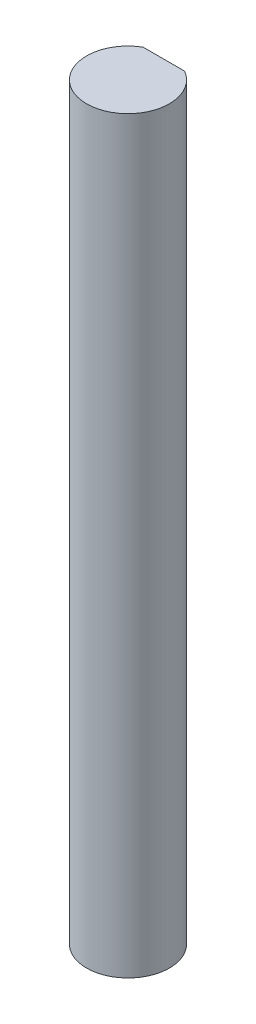
ISO-10303-21;
HEADER;
FILE_DESCRIPTION(('STEP AP214'),'2;1');
FILE_NAME('part.step','',(''),(''),'','','');
FILE_SCHEMA(('AUTOMOTIVE_DESIGN { 1 0 10303 214 1 1 1 1 }'));
ENDSEC;
DATA;
#1=APPLICATION_CONTEXT('core data for automotive mechanical design processes');
#2=APPLICATION_PROTOCOL_DEFINITION('international standard','automotive_design',2000,#1);
#3=PRODUCT_CONTEXT('',#1,'mechanical');
#4=PRODUCT('Part','Part','',(#3));
#5=PRODUCT_RELATED_PRODUCT_CATEGORY('part','',(#4));
#6=PRODUCT_DEFINITION_FORMATION('','',#4);
#7=PRODUCT_DEFINITION_CONTEXT('part definition',#1,'design');
#8=PRODUCT_DEFINITION('design','',#6,#7);
#9=PRODUCT_DEFINITION_SHAPE('','',#8);
#10=(LENGTH_UNIT() NAMED_UNIT(*) SI_UNIT(.MILLI.,.METRE.));
#11=(NAMED_UNIT(*) PLANE_ANGLE_UNIT() SI_UNIT($,.RADIAN.));
#12=(NAMED_UNIT(*) SI_UNIT($,.STERADIAN.) SOLID_ANGLE_UNIT());
#13=UNCERTAINTY_MEASURE_WITH_UNIT(LENGTH_MEASURE(1.E-05),#10,'distance_accuracy_value','');
#14=(GEOMETRIC_REPRESENTATION_CONTEXT(3) GLOBAL_UNCERTAINTY_ASSIGNED_CONTEXT((#13)) GLOBAL_UNIT_ASSIGNED_CONTEXT((#10,
#11,#12)) REPRESENTATION_CONTEXT('',''));
#15=CARTESIAN_POINT('',(0.,0.,0.));
#16=DIRECTION('',(0.,0.,1.));
#17=DIRECTION('',(1.,0.,0.));
#18=AXIS2_PLACEMENT_3D('',#15,#16,#17);
#19=CARTESIAN_POINT('',(0.,-43.000000106,-4.12077328786722));
#20=DIRECTION('',(0.,0.,1.));
#21=DIRECTION('',(1.,0.,0.));
#22=AXIS2_PLACEMENT_3D('',#19,#20,#21);
#23=PLANE('',#22);
#24=DIRECTION('',(0.,1.,0.));
#25=VECTOR('',#24,1.);
#26=CARTESIAN_POINT('',(-2.3876,-43.000000106,-4.12077328786722));
#27=LINE('',#26,#25);
#28=CARTESIAN_POINT('',(-2.3876,-43.000000106,-4.12077328786722));
#29=VERTEX_POINT('',#28);
#30=CARTESIAN_POINT('',(-2.3876,43.,-4.12077328786722));
#31=VERTEX_POINT('',#30);
#32=EDGE_CURVE('E44',#29,#31,#27,.T.);
#33=ORIENTED_EDGE('',*,*,#32,.T.);
#34=DIRECTION('',(1.,0.,0.));
#35=VECTOR('',#34,1.);
#36=CARTESIAN_POINT('',(0.,43.,-4.12077328786722));
#37=LINE('',#36,#35);
#38=CARTESIAN_POINT('',(2.3876,43.,-4.12077328786722));
#39=VERTEX_POINT('',#38);
#40=EDGE_CURVE('E69',#31,#39,#37,.T.);
#41=ORIENTED_EDGE('',*,*,#40,.T.);
#42=DIRECTION('',(0.,1.,0.));
#43=VECTOR('',#42,1.);
#44=CARTESIAN_POINT('',(2.3876,-43.000000106,-4.12077328786722));
#45=LINE('',#44,#43);
#46=CARTESIAN_POINT('',(2.3876,-43.000000106,-4.12077328786722));
#47=VERTEX_POINT('',#46);
#48=EDGE_CURVE('E11',#47,#39,#45,.T.);
#49=ORIENTED_EDGE('',*,*,#48,.F.);
#50=DIRECTION('',(1.,0.,0.));
#51=VECTOR('',#50,1.);
#52=CARTESIAN_POINT('',(0.,-43.000000106,-4.12077328786722));
#53=LINE('',#52,#51);
#54=EDGE_CURVE('E55',#29,#47,#53,.T.);
#55=ORIENTED_EDGE('',*,*,#54,.F.);
#56=EDGE_LOOP('',(#33,#41,#49,#55));
#57=FACE_BOUND('',#56,.T.);
#58=ADVANCED_FACE('F41',(#57),#23,.F.);
#59=CARTESIAN_POINT('',(0.,-43.000000106,0.));
#60=DIRECTION('',(0.,1.,0.));
#61=DIRECTION('',(0.,0.,1.));
#62=AXIS2_PLACEMENT_3D('',#59,#60,#61);
#63=CYLINDRICAL_SURFACE('',#62,4.7625);
#64=ORIENTED_EDGE('',*,*,#48,.T.);
#65=CARTESIAN_POINT('',(0.,43.,0.));
#66=DIRECTION('',(0.,1.,0.));
#67=DIRECTION('',(0.,0.,1.));
#68=AXIS2_PLACEMENT_3D('',#65,#66,#67);
#69=CIRCLE('',#68,4.7625);
#70=EDGE_CURVE('E73',#31,#39,#69,.T.);
#71=ORIENTED_EDGE('',*,*,#70,.F.);
#72=ORIENTED_EDGE('',*,*,#32,.F.);
#73=CARTESIAN_POINT('',(0.,-43.000000106,0.));
#74=DIRECTION('',(0.,1.,0.));
#75=DIRECTION('',(0.,0.,1.));
#76=AXIS2_PLACEMENT_3D('',#73,#74,#75);
#77=CIRCLE('',#76,4.7625);
#78=EDGE_CURVE('E71',#29,#47,#77,.T.);
#79=ORIENTED_EDGE('',*,*,#78,.T.);
#80=EDGE_LOOP('',(#64,#71,#72,#79));
#81=FACE_BOUND('',#80,.T.);
#82=ADVANCED_FACE('F74',(#81),#63,.T.);
#83=CARTESIAN_POINT('',(0.,-43.000000106,0.));
#84=DIRECTION('',(0.,1.,0.));
#85=DIRECTION('',(0.,0.,1.));
#86=AXIS2_PLACEMENT_3D('',#83,#84,#85);
#87=PLANE('',#86);
#88=ORIENTED_EDGE('',*,*,#54,.T.);
#89=ORIENTED_EDGE('',*,*,#78,.F.);
#90=EDGE_LOOP('',(#88,#89));
#91=FACE_BOUND('',#90,.T.);
#92=ADVANCED_FACE('F85',(#91),#87,.F.);
#93=CARTESIAN_POINT('',(0.,43.,0.));
#94=DIRECTION('',(0.,1.,0.));
#95=DIRECTION('',(0.,0.,1.));
#96=AXIS2_PLACEMENT_3D('',#93,#94,#95);
#97=PLANE('',#96);
#98=ORIENTED_EDGE('',*,*,#40,.F.);
#99=ORIENTED_EDGE('',*,*,#70,.T.);
#100=EDGE_LOOP('',(#98,#99));
#101=FACE_BOUND('',#100,.T.);
#102=ADVANCED_FACE('F78',(#101),#97,.T.);
#103=CLOSED_SHELL('',(#58,#82,#92,#102));
#104=MANIFOLD_SOLID_BREP('B2',#103);
#105=ADVANCED_BREP_SHAPE_REPRESENTATION('',(#18,#104),#14);
#106=SHAPE_DEFINITION_REPRESENTATION(#9,#105);
ENDSEC;
END-ISO-10303-21;
